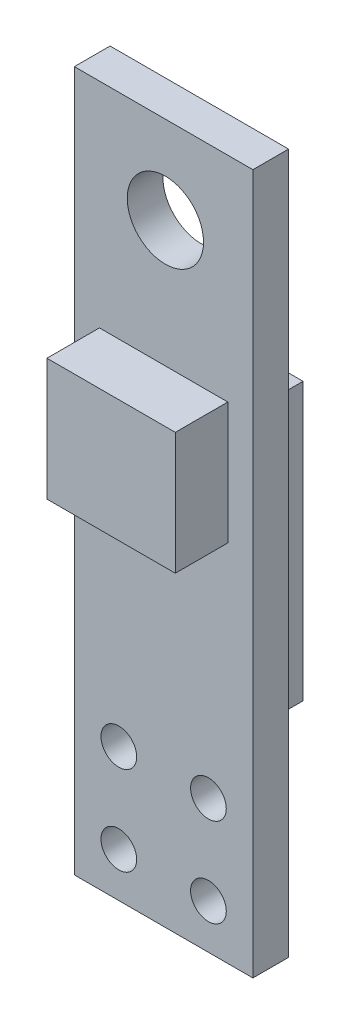
ISO-10303-21;
HEADER;
FILE_DESCRIPTION(('STEP AP214'),'2;1');
FILE_NAME('part.step','',(''),(''),'','','');
FILE_SCHEMA(('AUTOMOTIVE_DESIGN { 1 0 10303 214 1 1 1 1 }'));
ENDSEC;
DATA;
#1=APPLICATION_CONTEXT('core data for automotive mechanical design processes');
#2=APPLICATION_PROTOCOL_DEFINITION('international standard','automotive_design',2000,#1);
#3=PRODUCT_CONTEXT('',#1,'mechanical');
#4=PRODUCT('Part','Part','',(#3));
#5=PRODUCT_RELATED_PRODUCT_CATEGORY('part','',(#4));
#6=PRODUCT_DEFINITION_FORMATION('','',#4);
#7=PRODUCT_DEFINITION_CONTEXT('part definition',#1,'design');
#8=PRODUCT_DEFINITION('design','',#6,#7);
#9=PRODUCT_DEFINITION_SHAPE('','',#8);
#10=(LENGTH_UNIT() NAMED_UNIT(*) SI_UNIT(.MILLI.,.METRE.));
#11=(NAMED_UNIT(*) PLANE_ANGLE_UNIT() SI_UNIT($,.RADIAN.));
#12=(NAMED_UNIT(*) SI_UNIT($,.STERADIAN.) SOLID_ANGLE_UNIT());
#13=UNCERTAINTY_MEASURE_WITH_UNIT(LENGTH_MEASURE(1.E-05),#10,'distance_accuracy_value','');
#14=(GEOMETRIC_REPRESENTATION_CONTEXT(3) GLOBAL_UNCERTAINTY_ASSIGNED_CONTEXT((#13)) GLOBAL_UNIT_ASSIGNED_CONTEXT((#10,
#11,#12)) REPRESENTATION_CONTEXT('',''));
#15=CARTESIAN_POINT('',(0.,0.,0.));
#16=DIRECTION('',(0.,0.,1.));
#17=DIRECTION('',(1.,0.,0.));
#18=AXIS2_PLACEMENT_3D('',#15,#16,#17);
#19=CARTESIAN_POINT('',(0.,0.,0.));
#20=DIRECTION('',(0.,0.,-1.));
#21=DIRECTION('',(-1.,0.,0.));
#22=AXIS2_PLACEMENT_3D('',#19,#20,#21);
#23=PLANE('',#22);
#24=CARTESIAN_POINT('',(-1.28,-8.73,0.));
#25=DIRECTION('',(0.,0.,1.));
#26=DIRECTION('',(1.,0.,0.));
#27=AXIS2_PLACEMENT_3D('',#24,#25,#26);
#28=CIRCLE('',#27,0.51);
#29=CARTESIAN_POINT('',(-0.77,-8.73,0.));
#30=VERTEX_POINT('',#29);
#31=EDGE_CURVE('E184',#30,#30,#28,.T.);
#32=ORIENTED_EDGE('',*,*,#31,.T.);
#33=EDGE_LOOP('',(#32));
#34=FACE_BOUND('',#33,.T.);
#35=CARTESIAN_POINT('',(1.28,-6.19,0.));
#36=DIRECTION('',(0.,0.,1.));
#37=DIRECTION('',(1.,0.,0.));
#38=AXIS2_PLACEMENT_3D('',#35,#36,#37);
#39=CIRCLE('',#38,0.51);
#40=CARTESIAN_POINT('',(1.79,-6.19,0.));
#41=VERTEX_POINT('',#40);
#42=EDGE_CURVE('E196',#41,#41,#39,.T.);
#43=ORIENTED_EDGE('',*,*,#42,.T.);
#44=EDGE_LOOP('',(#43));
#45=FACE_BOUND('',#44,.T.);
#46=DIRECTION('',(0.,1.,0.));
#47=VECTOR('',#46,1.);
#48=CARTESIAN_POINT('',(2.55,-10.,0.));
#49=LINE('',#48,#47);
#50=CARTESIAN_POINT('',(2.55,-10.,0.));
#51=VERTEX_POINT('',#50);
#52=CARTESIAN_POINT('',(2.55,10.,0.));
#53=VERTEX_POINT('',#52);
#54=EDGE_CURVE('E208',#51,#53,#49,.T.);
#55=ORIENTED_EDGE('',*,*,#54,.F.);
#56=DIRECTION('',(1.,0.,0.));
#57=VECTOR('',#56,1.);
#58=CARTESIAN_POINT('',(-2.55,-10.,0.));
#59=LINE('',#58,#57);
#60=CARTESIAN_POINT('',(-2.55,-10.,0.));
#61=VERTEX_POINT('',#60);
#62=EDGE_CURVE('E215',#61,#51,#59,.T.);
#63=ORIENTED_EDGE('',*,*,#62,.F.);
#64=DIRECTION('',(0.,-1.,0.));
#65=VECTOR('',#64,1.);
#66=CARTESIAN_POINT('',(-2.55,-10.,0.));
#67=LINE('',#66,#65);
#68=CARTESIAN_POINT('',(-2.55,10.,0.));
#69=VERTEX_POINT('',#68);
#70=EDGE_CURVE('E226',#69,#61,#67,.T.);
#71=ORIENTED_EDGE('',*,*,#70,.F.);
#72=DIRECTION('',(-1.,0.,0.));
#73=VECTOR('',#72,1.);
#74=CARTESIAN_POINT('',(-2.55,10.,0.));
#75=LINE('',#74,#73);
#76=EDGE_CURVE('E224',#53,#69,#75,.T.);
#77=ORIENTED_EDGE('',*,*,#76,.F.);
#78=EDGE_LOOP('',(#55,#63,#71,#77));
#79=FACE_BOUND('',#78,.T.);
#80=CARTESIAN_POINT('',(0.0500000000000006,7.5,0.));
#81=DIRECTION('',(0.,0.,1.));
#82=DIRECTION('',(1.,0.,0.));
#83=AXIS2_PLACEMENT_3D('',#80,#81,#82);
#84=CIRCLE('',#83,1.09);
#85=CARTESIAN_POINT('',(1.14,7.5,0.));
#86=VERTEX_POINT('',#85);
#87=EDGE_CURVE('E202',#86,#86,#84,.T.);
#88=ORIENTED_EDGE('',*,*,#87,.T.);
#89=EDGE_LOOP('',(#88));
#90=FACE_BOUND('',#89,.T.);
#91=CARTESIAN_POINT('',(1.28,-8.73,0.));
#92=DIRECTION('',(0.,0.,1.));
#93=DIRECTION('',(1.,0.,0.));
#94=AXIS2_PLACEMENT_3D('',#91,#92,#93);
#95=CIRCLE('',#94,0.51);
#96=CARTESIAN_POINT('',(1.79,-8.73,0.));
#97=VERTEX_POINT('',#96);
#98=EDGE_CURVE('E190',#97,#97,#95,.T.);
#99=ORIENTED_EDGE('',*,*,#98,.T.);
#100=EDGE_LOOP('',(#99));
#101=FACE_BOUND('',#100,.T.);
#102=CARTESIAN_POINT('',(-1.28,-6.19,0.));
#103=DIRECTION('',(0.,0.,1.));
#104=DIRECTION('',(1.,0.,0.));
#105=AXIS2_PLACEMENT_3D('',#102,#103,#104);
#106=CIRCLE('',#105,0.51);
#107=CARTESIAN_POINT('',(-0.77,-6.19,0.));
#108=VERTEX_POINT('',#107);
#109=EDGE_CURVE('E180',#108,#108,#106,.T.);
#110=ORIENTED_EDGE('',*,*,#109,.T.);
#111=EDGE_LOOP('',(#110));
#112=FACE_BOUND('',#111,.T.);
#113=DIRECTION('',(1.,0.,0.));
#114=VECTOR('',#113,1.);
#115=CARTESIAN_POINT('',(1.86346540115719,3.36065432153686,0.));
#116=LINE('',#115,#114);
#117=CARTESIAN_POINT('',(-1.86346540115719,3.36065432153686,0.));
#118=VERTEX_POINT('',#117);
#119=CARTESIAN_POINT('',(1.86346540115719,3.36065432153686,0.));
#120=VERTEX_POINT('',#119);
#121=EDGE_CURVE('E455',#118,#120,#116,.T.);
#122=ORIENTED_EDGE('',*,*,#121,.F.);
#123=DIRECTION('',(0.,1.,0.));
#124=VECTOR('',#123,1.);
#125=CARTESIAN_POINT('',(-1.86346540115719,3.36065432153686,0.));
#126=LINE('',#125,#124);
#127=CARTESIAN_POINT('',(-1.86346540115719,-4.54575551302075,0.));
#128=VERTEX_POINT('',#127);
#129=EDGE_CURVE('E144',#128,#118,#126,.T.);
#130=ORIENTED_EDGE('',*,*,#129,.F.);
#131=DIRECTION('',(-1.,0.,0.));
#132=VECTOR('',#131,1.);
#133=CARTESIAN_POINT('',(1.86346540115719,-4.54575551302075,0.));
#134=LINE('',#133,#132);
#135=CARTESIAN_POINT('',(1.86346540115719,-4.54575551302075,0.));
#136=VERTEX_POINT('',#135);
#137=EDGE_CURVE('E140',#136,#128,#134,.T.);
#138=ORIENTED_EDGE('',*,*,#137,.F.);
#139=DIRECTION('',(0.,-1.,0.));
#140=VECTOR('',#139,1.);
#141=CARTESIAN_POINT('',(1.86346540115719,3.36065432153686,0.));
#142=LINE('',#141,#140);
#143=EDGE_CURVE('E452',#120,#136,#142,.T.);
#144=ORIENTED_EDGE('',*,*,#143,.F.);
#145=EDGE_LOOP('',(#122,#130,#138,#144));
#146=FACE_BOUND('',#145,.T.);
#147=ADVANCED_FACE('F32',(#34,#45,#79,#90,#101,#112,#146),#23,.T.);
#148=CARTESIAN_POINT('',(0.,0.,1.02));
#149=DIRECTION('',(0.,0.,-1.));
#150=DIRECTION('',(-1.,0.,0.));
#151=AXIS2_PLACEMENT_3D('',#148,#149,#150);
#152=PLANE('',#151);
#153=CARTESIAN_POINT('',(-1.28,-6.19,1.02));
#154=DIRECTION('',(0.,0.,1.));
#155=DIRECTION('',(1.,0.,0.));
#156=AXIS2_PLACEMENT_3D('',#153,#154,#155);
#157=CIRCLE('',#156,0.51);
#158=CARTESIAN_POINT('',(-0.77,-6.19,1.02));
#159=VERTEX_POINT('',#158);
#160=EDGE_CURVE('E181',#159,#159,#157,.T.);
#161=ORIENTED_EDGE('',*,*,#160,.F.);
#162=EDGE_LOOP('',(#161));
#163=FACE_BOUND('',#162,.T.);
#164=CARTESIAN_POINT('',(-1.28,-8.73,1.02));
#165=DIRECTION('',(0.,0.,1.));
#166=DIRECTION('',(1.,0.,0.));
#167=AXIS2_PLACEMENT_3D('',#164,#165,#166);
#168=CIRCLE('',#167,0.51);
#169=CARTESIAN_POINT('',(-0.77,-8.73,1.02));
#170=VERTEX_POINT('',#169);
#171=EDGE_CURVE('E187',#170,#170,#168,.T.);
#172=ORIENTED_EDGE('',*,*,#171,.F.);
#173=EDGE_LOOP('',(#172));
#174=FACE_BOUND('',#173,.T.);
#175=CARTESIAN_POINT('',(1.28,-8.73,1.02));
#176=DIRECTION('',(0.,0.,1.));
#177=DIRECTION('',(1.,0.,0.));
#178=AXIS2_PLACEMENT_3D('',#175,#176,#177);
#179=CIRCLE('',#178,0.51);
#180=CARTESIAN_POINT('',(1.79,-8.73,1.02));
#181=VERTEX_POINT('',#180);
#182=EDGE_CURVE('E193',#181,#181,#179,.T.);
#183=ORIENTED_EDGE('',*,*,#182,.F.);
#184=EDGE_LOOP('',(#183));
#185=FACE_BOUND('',#184,.T.);
#186=CARTESIAN_POINT('',(1.28,-6.19,1.02));
#187=DIRECTION('',(0.,0.,1.));
#188=DIRECTION('',(1.,0.,0.));
#189=AXIS2_PLACEMENT_3D('',#186,#187,#188);
#190=CIRCLE('',#189,0.51);
#191=CARTESIAN_POINT('',(1.79,-6.19,1.02));
#192=VERTEX_POINT('',#191);
#193=EDGE_CURVE('E199',#192,#192,#190,.T.);
#194=ORIENTED_EDGE('',*,*,#193,.F.);
#195=EDGE_LOOP('',(#194));
#196=FACE_BOUND('',#195,.T.);
#197=CARTESIAN_POINT('',(0.0500000000000006,7.5,1.02));
#198=DIRECTION('',(0.,0.,1.));
#199=DIRECTION('',(1.,0.,0.));
#200=AXIS2_PLACEMENT_3D('',#197,#198,#199);
#201=CIRCLE('',#200,1.09);
#202=CARTESIAN_POINT('',(1.14,7.5,1.02));
#203=VERTEX_POINT('',#202);
#204=EDGE_CURVE('E205',#203,#203,#201,.T.);
#205=ORIENTED_EDGE('',*,*,#204,.F.);
#206=EDGE_LOOP('',(#205));
#207=FACE_BOUND('',#206,.T.);
#208=DIRECTION('',(0.,1.,0.));
#209=VECTOR('',#208,1.);
#210=CARTESIAN_POINT('',(2.55,-10.,1.02));
#211=LINE('',#210,#209);
#212=CARTESIAN_POINT('',(2.55,-10.,1.02));
#213=VERTEX_POINT('',#212);
#214=CARTESIAN_POINT('',(2.55,10.,1.02));
#215=VERTEX_POINT('',#214);
#216=EDGE_CURVE('E211',#213,#215,#211,.T.);
#217=ORIENTED_EDGE('',*,*,#216,.T.);
#218=DIRECTION('',(-1.,0.,0.));
#219=VECTOR('',#218,1.);
#220=CARTESIAN_POINT('',(-2.55,10.,1.02));
#221=LINE('',#220,#219);
#222=CARTESIAN_POINT('',(-2.55,10.,1.02));
#223=VERTEX_POINT('',#222);
#224=EDGE_CURVE('E214',#215,#223,#221,.T.);
#225=ORIENTED_EDGE('',*,*,#224,.T.);
#226=DIRECTION('',(0.,-1.,0.));
#227=VECTOR('',#226,1.);
#228=CARTESIAN_POINT('',(-2.55,-10.,1.02));
#229=LINE('',#228,#227);
#230=CARTESIAN_POINT('',(-2.55,-10.,1.02));
#231=VERTEX_POINT('',#230);
#232=EDGE_CURVE('E217',#223,#231,#229,.T.);
#233=ORIENTED_EDGE('',*,*,#232,.T.);
#234=DIRECTION('',(1.,0.,0.));
#235=VECTOR('',#234,1.);
#236=CARTESIAN_POINT('',(-2.55,-10.,1.02));
#237=LINE('',#236,#235);
#238=EDGE_CURVE('E219',#231,#213,#237,.T.);
#239=ORIENTED_EDGE('',*,*,#238,.T.);
#240=EDGE_LOOP('',(#217,#225,#233,#239));
#241=FACE_BOUND('',#240,.T.);
#242=DIRECTION('',(0.,1.,0.));
#243=VECTOR('',#242,1.);
#244=CARTESIAN_POINT('',(1.83361524667049,3.89334107153793,1.02));
#245=LINE('',#244,#243);
#246=CARTESIAN_POINT('',(1.83361524667049,0.406658928462075,1.02));
#247=VERTEX_POINT('',#246);
#248=CARTESIAN_POINT('',(1.83361524667049,3.89334107153793,1.02));
#249=VERTEX_POINT('',#248);
#250=EDGE_CURVE('E55',#247,#249,#245,.T.);
#251=ORIENTED_EDGE('',*,*,#250,.F.);
#252=DIRECTION('',(1.,0.,0.));
#253=VECTOR('',#252,1.);
#254=CARTESIAN_POINT('',(-1.83361524667049,0.406658928462075,1.02));
#255=LINE('',#254,#253);
#256=CARTESIAN_POINT('',(-1.83361524667049,0.406658928462075,1.02));
#257=VERTEX_POINT('',#256);
#258=EDGE_CURVE('E156',#257,#247,#255,.T.);
#259=ORIENTED_EDGE('',*,*,#258,.F.);
#260=DIRECTION('',(0.,-1.,0.));
#261=VECTOR('',#260,1.);
#262=CARTESIAN_POINT('',(-1.83361524667049,3.89334107153793,1.02));
#263=LINE('',#262,#261);
#264=CARTESIAN_POINT('',(-1.83361524667049,3.89334107153793,1.02));
#265=VERTEX_POINT('',#264);
#266=EDGE_CURVE('E165',#265,#257,#263,.T.);
#267=ORIENTED_EDGE('',*,*,#266,.F.);
#268=DIRECTION('',(-1.,0.,0.));
#269=VECTOR('',#268,1.);
#270=CARTESIAN_POINT('',(-1.83361524667049,3.89334107153793,1.02));
#271=LINE('',#270,#269);
#272=EDGE_CURVE('E147',#249,#265,#271,.T.);
#273=ORIENTED_EDGE('',*,*,#272,.F.);
#274=EDGE_LOOP('',(#251,#259,#267,#273));
#275=FACE_BOUND('',#274,.T.);
#276=ADVANCED_FACE('F253',(#163,#174,#185,#196,#207,#241,#275),#152,.F.);
#277=CARTESIAN_POINT('',(2.55,-10.,1.02));
#278=DIRECTION('',(-1.,0.,0.));
#279=DIRECTION('',(0.,0.,1.));
#280=AXIS2_PLACEMENT_3D('',#277,#278,#279);
#281=PLANE('',#280);
#282=ORIENTED_EDGE('',*,*,#54,.T.);
#283=DIRECTION('',(0.,0.,-1.));
#284=VECTOR('',#283,1.);
#285=CARTESIAN_POINT('',(2.55,10.,1.02));
#286=LINE('',#285,#284);
#287=EDGE_CURVE('E11',#215,#53,#286,.T.);
#288=ORIENTED_EDGE('',*,*,#287,.F.);
#289=ORIENTED_EDGE('',*,*,#216,.F.);
#290=DIRECTION('',(0.,0.,-1.));
#291=VECTOR('',#290,1.);
#292=CARTESIAN_POINT('',(2.55,-10.,1.02));
#293=LINE('',#292,#291);
#294=EDGE_CURVE('E221',#213,#51,#293,.T.);
#295=ORIENTED_EDGE('',*,*,#294,.T.);
#296=EDGE_LOOP('',(#282,#288,#289,#295));
#297=FACE_BOUND('',#296,.T.);
#298=ADVANCED_FACE('F34',(#297),#281,.F.);
#299=CARTESIAN_POINT('',(-2.55,10.,1.02));
#300=DIRECTION('',(0.,-1.,0.));
#301=DIRECTION('',(0.,0.,-1.));
#302=AXIS2_PLACEMENT_3D('',#299,#300,#301);
#303=PLANE('',#302);
#304=ORIENTED_EDGE('',*,*,#76,.T.);
#305=DIRECTION('',(0.,0.,-1.));
#306=VECTOR('',#305,1.);
#307=CARTESIAN_POINT('',(-2.55,10.,1.02));
#308=LINE('',#307,#306);
#309=EDGE_CURVE('E40',#223,#69,#308,.T.);
#310=ORIENTED_EDGE('',*,*,#309,.F.);
#311=ORIENTED_EDGE('',*,*,#224,.F.);
#312=ORIENTED_EDGE('',*,*,#287,.T.);
#313=EDGE_LOOP('',(#304,#310,#311,#312));
#314=FACE_BOUND('',#313,.T.);
#315=ADVANCED_FACE('F254',(#314),#303,.F.);
#316=CARTESIAN_POINT('',(-2.55,-10.,1.02));
#317=DIRECTION('',(1.,0.,0.));
#318=DIRECTION('',(0.,0.,-1.));
#319=AXIS2_PLACEMENT_3D('',#316,#317,#318);
#320=PLANE('',#319);
#321=ORIENTED_EDGE('',*,*,#70,.T.);
#322=DIRECTION('',(0.,0.,-1.));
#323=VECTOR('',#322,1.);
#324=CARTESIAN_POINT('',(-2.55,-10.,1.02));
#325=LINE('',#324,#323);
#326=EDGE_CURVE('E231',#231,#61,#325,.T.);
#327=ORIENTED_EDGE('',*,*,#326,.F.);
#328=ORIENTED_EDGE('',*,*,#232,.F.);
#329=ORIENTED_EDGE('',*,*,#309,.T.);
#330=EDGE_LOOP('',(#321,#327,#328,#329));
#331=FACE_BOUND('',#330,.T.);
#332=ADVANCED_FACE('F238',(#331),#320,.F.);
#333=CARTESIAN_POINT('',(-2.55,-10.,1.02));
#334=DIRECTION('',(0.,1.,0.));
#335=DIRECTION('',(0.,0.,1.));
#336=AXIS2_PLACEMENT_3D('',#333,#334,#335);
#337=PLANE('',#336);
#338=ORIENTED_EDGE('',*,*,#62,.T.);
#339=ORIENTED_EDGE('',*,*,#294,.F.);
#340=ORIENTED_EDGE('',*,*,#238,.F.);
#341=ORIENTED_EDGE('',*,*,#326,.T.);
#342=EDGE_LOOP('',(#338,#339,#340,#341));
#343=FACE_BOUND('',#342,.T.);
#344=ADVANCED_FACE('F247',(#343),#337,.F.);
#345=CARTESIAN_POINT('',(0.0500000000000006,7.5,1.02));
#346=DIRECTION('',(0.,0.,-1.));
#347=DIRECTION('',(-1.,0.,0.));
#348=AXIS2_PLACEMENT_3D('',#345,#346,#347);
#349=CYLINDRICAL_SURFACE('',#348,1.09);
#350=ORIENTED_EDGE('',*,*,#204,.T.);
#351=EDGE_LOOP('',(#350));
#352=FACE_BOUND('',#351,.T.);
#353=ORIENTED_EDGE('',*,*,#87,.F.);
#354=EDGE_LOOP('',(#353));
#355=FACE_BOUND('',#354,.T.);
#356=ADVANCED_FACE('F273',(#352,#355),#349,.F.);
#357=CARTESIAN_POINT('',(1.28,-6.19,1.02));
#358=DIRECTION('',(0.,0.,-1.));
#359=DIRECTION('',(-1.,0.,0.));
#360=AXIS2_PLACEMENT_3D('',#357,#358,#359);
#361=CYLINDRICAL_SURFACE('',#360,0.51);
#362=ORIENTED_EDGE('',*,*,#193,.T.);
#363=EDGE_LOOP('',(#362));
#364=FACE_BOUND('',#363,.T.);
#365=ORIENTED_EDGE('',*,*,#42,.F.);
#366=EDGE_LOOP('',(#365));
#367=FACE_BOUND('',#366,.T.);
#368=ADVANCED_FACE('F277',(#364,#367),#361,.F.);
#369=CARTESIAN_POINT('',(1.28,-8.73,1.02));
#370=DIRECTION('',(0.,0.,-1.));
#371=DIRECTION('',(-1.,0.,0.));
#372=AXIS2_PLACEMENT_3D('',#369,#370,#371);
#373=CYLINDRICAL_SURFACE('',#372,0.51);
#374=ORIENTED_EDGE('',*,*,#182,.T.);
#375=EDGE_LOOP('',(#374));
#376=FACE_BOUND('',#375,.T.);
#377=ORIENTED_EDGE('',*,*,#98,.F.);
#378=EDGE_LOOP('',(#377));
#379=FACE_BOUND('',#378,.T.);
#380=ADVANCED_FACE('F282',(#376,#379),#373,.F.);
#381=CARTESIAN_POINT('',(-1.28,-8.73,1.02));
#382=DIRECTION('',(0.,0.,-1.));
#383=DIRECTION('',(-1.,0.,0.));
#384=AXIS2_PLACEMENT_3D('',#381,#382,#383);
#385=CYLINDRICAL_SURFACE('',#384,0.51);
#386=ORIENTED_EDGE('',*,*,#171,.T.);
#387=EDGE_LOOP('',(#386));
#388=FACE_BOUND('',#387,.T.);
#389=ORIENTED_EDGE('',*,*,#31,.F.);
#390=EDGE_LOOP('',(#389));
#391=FACE_BOUND('',#390,.T.);
#392=ADVANCED_FACE('F289',(#388,#391),#385,.F.);
#393=CARTESIAN_POINT('',(-1.28,-6.19,1.02));
#394=DIRECTION('',(0.,0.,-1.));
#395=DIRECTION('',(-1.,0.,0.));
#396=AXIS2_PLACEMENT_3D('',#393,#394,#395);
#397=CYLINDRICAL_SURFACE('',#396,0.51);
#398=ORIENTED_EDGE('',*,*,#160,.T.);
#399=EDGE_LOOP('',(#398));
#400=FACE_BOUND('',#399,.T.);
#401=ORIENTED_EDGE('',*,*,#109,.F.);
#402=EDGE_LOOP('',(#401));
#403=FACE_BOUND('',#402,.T.);
#404=ADVANCED_FACE('F293',(#400,#403),#397,.F.);
#405=CARTESIAN_POINT('',(1.83361524667049,3.89334107153793,2.52));
#406=DIRECTION('',(-1.,0.,0.));
#407=DIRECTION('',(0.,0.,1.));
#408=AXIS2_PLACEMENT_3D('',#405,#406,#407);
#409=PLANE('',#408);
#410=ORIENTED_EDGE('',*,*,#250,.T.);
#411=DIRECTION('',(0.,0.,-1.));
#412=VECTOR('',#411,1.);
#413=CARTESIAN_POINT('',(1.83361524667049,3.89334107153793,2.52));
#414=LINE('',#413,#412);
#415=CARTESIAN_POINT('',(1.83361524667049,3.89334107153793,2.52));
#416=VERTEX_POINT('',#415);
#417=EDGE_CURVE('E177',#416,#249,#414,.T.);
#418=ORIENTED_EDGE('',*,*,#417,.F.);
#419=DIRECTION('',(0.,1.,0.));
#420=VECTOR('',#419,1.);
#421=CARTESIAN_POINT('',(1.83361524667049,3.89334107153793,2.52));
#422=LINE('',#421,#420);
#423=CARTESIAN_POINT('',(1.83361524667049,0.406658928462075,2.52));
#424=VERTEX_POINT('',#423);
#425=EDGE_CURVE('E152',#424,#416,#422,.T.);
#426=ORIENTED_EDGE('',*,*,#425,.F.);
#427=DIRECTION('',(0.,0.,-1.));
#428=VECTOR('',#427,1.);
#429=CARTESIAN_POINT('',(1.83361524667049,0.406658928462075,2.52));
#430=LINE('',#429,#428);
#431=EDGE_CURVE('E161',#424,#247,#430,.T.);
#432=ORIENTED_EDGE('',*,*,#431,.T.);
#433=EDGE_LOOP('',(#410,#418,#426,#432));
#434=FACE_BOUND('',#433,.T.);
#435=ADVANCED_FACE('F297',(#434),#409,.F.);
#436=CARTESIAN_POINT('',(-1.83361524667049,3.89334107153793,2.52));
#437=DIRECTION('',(0.,-1.,0.));
#438=DIRECTION('',(0.,0.,-1.));
#439=AXIS2_PLACEMENT_3D('',#436,#437,#438);
#440=PLANE('',#439);
#441=ORIENTED_EDGE('',*,*,#272,.T.);
#442=DIRECTION('',(0.,0.,-1.));
#443=VECTOR('',#442,1.);
#444=CARTESIAN_POINT('',(-1.83361524667049,3.89334107153793,2.52));
#445=LINE('',#444,#443);
#446=CARTESIAN_POINT('',(-1.83361524667049,3.89334107153793,2.52));
#447=VERTEX_POINT('',#446);
#448=EDGE_CURVE('E174',#447,#265,#445,.T.);
#449=ORIENTED_EDGE('',*,*,#448,.F.);
#450=DIRECTION('',(-1.,0.,0.));
#451=VECTOR('',#450,1.);
#452=CARTESIAN_POINT('',(-1.83361524667049,3.89334107153793,2.52));
#453=LINE('',#452,#451);
#454=EDGE_CURVE('E155',#416,#447,#453,.T.);
#455=ORIENTED_EDGE('',*,*,#454,.F.);
#456=ORIENTED_EDGE('',*,*,#417,.T.);
#457=EDGE_LOOP('',(#441,#449,#455,#456));
#458=FACE_BOUND('',#457,.T.);
#459=ADVANCED_FACE('F301',(#458),#440,.F.);
#460=CARTESIAN_POINT('',(-1.83361524667049,3.89334107153793,2.52));
#461=DIRECTION('',(1.,0.,0.));
#462=DIRECTION('',(0.,0.,-1.));
#463=AXIS2_PLACEMENT_3D('',#460,#461,#462);
#464=PLANE('',#463);
#465=ORIENTED_EDGE('',*,*,#266,.T.);
#466=DIRECTION('',(0.,0.,-1.));
#467=VECTOR('',#466,1.);
#468=CARTESIAN_POINT('',(-1.83361524667049,0.406658928462075,2.52));
#469=LINE('',#468,#467);
#470=CARTESIAN_POINT('',(-1.83361524667049,0.406658928462075,2.52));
#471=VERTEX_POINT('',#470);
#472=EDGE_CURVE('E171',#471,#257,#469,.T.);
#473=ORIENTED_EDGE('',*,*,#472,.F.);
#474=DIRECTION('',(0.,-1.,0.));
#475=VECTOR('',#474,1.);
#476=CARTESIAN_POINT('',(-1.83361524667049,3.89334107153793,2.52));
#477=LINE('',#476,#475);
#478=EDGE_CURVE('E158',#447,#471,#477,.T.);
#479=ORIENTED_EDGE('',*,*,#478,.F.);
#480=ORIENTED_EDGE('',*,*,#448,.T.);
#481=EDGE_LOOP('',(#465,#473,#479,#480));
#482=FACE_BOUND('',#481,.T.);
#483=ADVANCED_FACE('F305',(#482),#464,.F.);
#484=CARTESIAN_POINT('',(-1.83361524667049,0.406658928462075,2.52));
#485=DIRECTION('',(0.,1.,0.));
#486=DIRECTION('',(0.,0.,1.));
#487=AXIS2_PLACEMENT_3D('',#484,#485,#486);
#488=PLANE('',#487);
#489=ORIENTED_EDGE('',*,*,#258,.T.);
#490=ORIENTED_EDGE('',*,*,#431,.F.);
#491=DIRECTION('',(1.,0.,0.));
#492=VECTOR('',#491,1.);
#493=CARTESIAN_POINT('',(-1.83361524667049,0.406658928462075,2.52));
#494=LINE('',#493,#492);
#495=EDGE_CURVE('E160',#471,#424,#494,.T.);
#496=ORIENTED_EDGE('',*,*,#495,.F.);
#497=ORIENTED_EDGE('',*,*,#472,.T.);
#498=EDGE_LOOP('',(#489,#490,#496,#497));
#499=FACE_BOUND('',#498,.T.);
#500=ADVANCED_FACE('F309',(#499),#488,.F.);
#501=CARTESIAN_POINT('',(0.,0.,2.52));
#502=DIRECTION('',(0.,0.,1.));
#503=DIRECTION('',(1.,0.,0.));
#504=AXIS2_PLACEMENT_3D('',#501,#502,#503);
#505=PLANE('',#504);
#506=ORIENTED_EDGE('',*,*,#425,.T.);
#507=ORIENTED_EDGE('',*,*,#454,.T.);
#508=ORIENTED_EDGE('',*,*,#478,.T.);
#509=ORIENTED_EDGE('',*,*,#495,.T.);
#510=EDGE_LOOP('',(#506,#507,#508,#509));
#511=FACE_BOUND('',#510,.T.);
#512=ADVANCED_FACE('F313',(#511),#505,.T.);
#513=CARTESIAN_POINT('',(-1.86346540115719,3.36065432153686,-1.1));
#514=DIRECTION('',(1.,0.,0.));
#515=DIRECTION('',(0.,0.,-1.));
#516=AXIS2_PLACEMENT_3D('',#513,#514,#515);
#517=PLANE('',#516);
#518=ORIENTED_EDGE('',*,*,#129,.T.);
#519=DIRECTION('',(0.,0.,1.));
#520=VECTOR('',#519,1.);
#521=CARTESIAN_POINT('',(-1.86346540115719,3.36065432153686,-1.1));
#522=LINE('',#521,#520);
#523=CARTESIAN_POINT('',(-1.86346540115719,3.36065432153686,-1.1));
#524=VERTEX_POINT('',#523);
#525=EDGE_CURVE('E125',#524,#118,#522,.T.);
#526=ORIENTED_EDGE('',*,*,#525,.F.);
#527=DIRECTION('',(0.,1.,0.));
#528=VECTOR('',#527,1.);
#529=CARTESIAN_POINT('',(-1.86346540115719,3.36065432153686,-1.1));
#530=LINE('',#529,#528);
#531=CARTESIAN_POINT('',(-1.86346540115719,-4.54575551302075,-1.1));
#532=VERTEX_POINT('',#531);
#533=EDGE_CURVE('E132',#532,#524,#530,.T.);
#534=ORIENTED_EDGE('',*,*,#533,.F.);
#535=DIRECTION('',(0.,0.,1.));
#536=VECTOR('',#535,1.);
#537=CARTESIAN_POINT('',(-1.86346540115719,-4.54575551302075,-1.1));
#538=LINE('',#537,#536);
#539=EDGE_CURVE('E449',#532,#128,#538,.T.);
#540=ORIENTED_EDGE('',*,*,#539,.T.);
#541=EDGE_LOOP('',(#518,#526,#534,#540));
#542=FACE_BOUND('',#541,.T.);
#543=ADVANCED_FACE('F142',(#542),#517,.F.);
#544=CARTESIAN_POINT('',(1.86346540115719,3.36065432153686,-1.1));
#545=DIRECTION('',(0.,-1.,0.));
#546=DIRECTION('',(0.,0.,-1.));
#547=AXIS2_PLACEMENT_3D('',#544,#545,#546);
#548=PLANE('',#547);
#549=ORIENTED_EDGE('',*,*,#121,.T.);
#550=DIRECTION('',(0.,0.,1.));
#551=VECTOR('',#550,1.);
#552=CARTESIAN_POINT('',(1.86346540115719,3.36065432153686,-1.1));
#553=LINE('',#552,#551);
#554=CARTESIAN_POINT('',(1.86346540115719,3.36065432153686,-1.1));
#555=VERTEX_POINT('',#554);
#556=EDGE_CURVE('E128',#555,#120,#553,.T.);
#557=ORIENTED_EDGE('',*,*,#556,.F.);
#558=DIRECTION('',(1.,0.,0.));
#559=VECTOR('',#558,1.);
#560=CARTESIAN_POINT('',(1.86346540115719,3.36065432153686,-1.1));
#561=LINE('',#560,#559);
#562=EDGE_CURVE('E121',#524,#555,#561,.T.);
#563=ORIENTED_EDGE('',*,*,#562,.F.);
#564=ORIENTED_EDGE('',*,*,#525,.T.);
#565=EDGE_LOOP('',(#549,#557,#563,#564));
#566=FACE_BOUND('',#565,.T.);
#567=ADVANCED_FACE('F123',(#566),#548,.F.);
#568=CARTESIAN_POINT('',(1.86346540115719,3.36065432153686,-1.1));
#569=DIRECTION('',(-1.,0.,0.));
#570=DIRECTION('',(0.,-1.,0.));
#571=AXIS2_PLACEMENT_3D('',#568,#569,#570);
#572=PLANE('',#571);
#573=ORIENTED_EDGE('',*,*,#143,.T.);
#574=DIRECTION('',(0.,0.,1.));
#575=VECTOR('',#574,1.);
#576=CARTESIAN_POINT('',(1.86346540115719,-4.54575551302075,-1.1));
#577=LINE('',#576,#575);
#578=CARTESIAN_POINT('',(1.86346540115719,-4.54575551302075,-1.1));
#579=VERTEX_POINT('',#578);
#580=EDGE_CURVE('E47',#579,#136,#577,.T.);
#581=ORIENTED_EDGE('',*,*,#580,.F.);
#582=DIRECTION('',(0.,-1.,0.));
#583=VECTOR('',#582,1.);
#584=CARTESIAN_POINT('',(1.86346540115719,3.36065432153686,-1.1));
#585=LINE('',#584,#583);
#586=EDGE_CURVE('E131',#555,#579,#585,.T.);
#587=ORIENTED_EDGE('',*,*,#586,.F.);
#588=ORIENTED_EDGE('',*,*,#556,.T.);
#589=EDGE_LOOP('',(#573,#581,#587,#588));
#590=FACE_BOUND('',#589,.T.);
#591=ADVANCED_FACE('F322',(#590),#572,.F.);
#592=CARTESIAN_POINT('',(1.86346540115719,-4.54575551302075,-1.1));
#593=DIRECTION('',(0.,1.,0.));
#594=DIRECTION('',(0.,0.,1.));
#595=AXIS2_PLACEMENT_3D('',#592,#593,#594);
#596=PLANE('',#595);
#597=ORIENTED_EDGE('',*,*,#137,.T.);
#598=ORIENTED_EDGE('',*,*,#539,.F.);
#599=DIRECTION('',(-1.,0.,0.));
#600=VECTOR('',#599,1.);
#601=CARTESIAN_POINT('',(1.86346540115719,-4.54575551302075,-1.1));
#602=LINE('',#601,#600);
#603=EDGE_CURVE('E136',#579,#532,#602,.T.);
#604=ORIENTED_EDGE('',*,*,#603,.F.);
#605=ORIENTED_EDGE('',*,*,#580,.T.);
#606=EDGE_LOOP('',(#597,#598,#604,#605));
#607=FACE_BOUND('',#606,.T.);
#608=ADVANCED_FACE('F325',(#607),#596,.F.);
#609=CARTESIAN_POINT('',(0.,0.,-1.1));
#610=DIRECTION('',(0.,0.,-1.));
#611=DIRECTION('',(-1.,0.,0.));
#612=AXIS2_PLACEMENT_3D('',#609,#610,#611);
#613=PLANE('',#612);
#614=ORIENTED_EDGE('',*,*,#533,.T.);
#615=ORIENTED_EDGE('',*,*,#562,.T.);
#616=ORIENTED_EDGE('',*,*,#586,.T.);
#617=ORIENTED_EDGE('',*,*,#603,.T.);
#618=EDGE_LOOP('',(#614,#615,#616,#617));
#619=FACE_BOUND('',#618,.T.);
#620=ADVANCED_FACE('F135',(#619),#613,.T.);
#621=CLOSED_SHELL('',(#147,#276,#298,#315,#332,#344,#356,#368,#380,#392,#404,#435,#459,#483,
#500,#512,#543,#567,#591,#608,#620));
#622=MANIFOLD_SOLID_BREP('B2',#621);
#623=ADVANCED_BREP_SHAPE_REPRESENTATION('',(#18,#622),#14);
#624=SHAPE_DEFINITION_REPRESENTATION(#9,#623);
ENDSEC;
END-ISO-10303-21;
